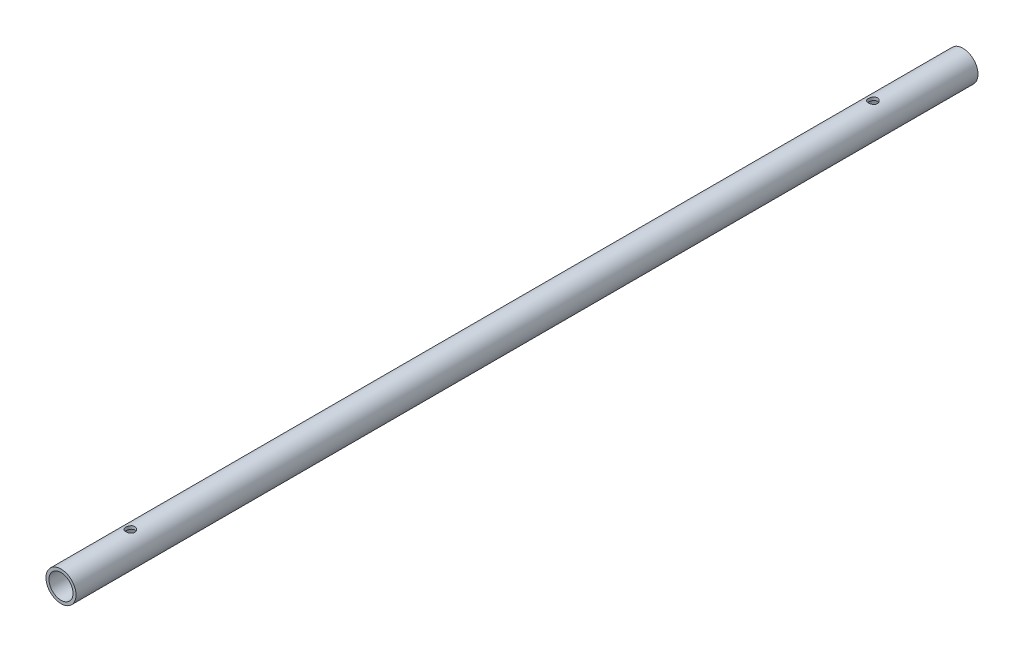
ISO-10303-21;
HEADER;
FILE_DESCRIPTION(('STEP AP214'),'2;1');
FILE_NAME('part.step','',(''),(''),'','','');
FILE_SCHEMA(('AUTOMOTIVE_DESIGN { 1 0 10303 214 1 1 1 1 }'));
ENDSEC;
DATA;
#1=APPLICATION_CONTEXT('core data for automotive mechanical design processes');
#2=APPLICATION_PROTOCOL_DEFINITION('international standard','automotive_design',2000,#1);
#3=PRODUCT_CONTEXT('',#1,'mechanical');
#4=PRODUCT('Part','Part','',(#3));
#5=PRODUCT_RELATED_PRODUCT_CATEGORY('part','',(#4));
#6=PRODUCT_DEFINITION_FORMATION('','',#4);
#7=PRODUCT_DEFINITION_CONTEXT('part definition',#1,'design');
#8=PRODUCT_DEFINITION('design','',#6,#7);
#9=PRODUCT_DEFINITION_SHAPE('','',#8);
#10=(LENGTH_UNIT() NAMED_UNIT(*) SI_UNIT(.MILLI.,.METRE.));
#11=(NAMED_UNIT(*) PLANE_ANGLE_UNIT() SI_UNIT($,.RADIAN.));
#12=(NAMED_UNIT(*) SI_UNIT($,.STERADIAN.) SOLID_ANGLE_UNIT());
#13=UNCERTAINTY_MEASURE_WITH_UNIT(LENGTH_MEASURE(1.E-05),#10,'distance_accuracy_value','');
#14=(GEOMETRIC_REPRESENTATION_CONTEXT(3) GLOBAL_UNCERTAINTY_ASSIGNED_CONTEXT((#13)) GLOBAL_UNIT_ASSIGNED_CONTEXT((#10,
#11,#12)) REPRESENTATION_CONTEXT('',''));
#15=CARTESIAN_POINT('',(0.,0.,0.));
#16=DIRECTION('',(0.,0.,1.));
#17=DIRECTION('',(1.,0.,0.));
#18=AXIS2_PLACEMENT_3D('',#15,#16,#17);
#19=CARTESIAN_POINT('',(0.,0.,300.));
#20=DIRECTION('',(0.,0.,-1.));
#21=DIRECTION('',(-1.,0.,0.));
#22=AXIS2_PLACEMENT_3D('',#19,#20,#21);
#23=CYLINDRICAL_SURFACE('',#22,5.);
#24=CARTESIAN_POINT('',(0.,0.,300.));
#25=DIRECTION('',(0.,0.,1.));
#26=DIRECTION('',(1.,0.,0.));
#27=AXIS2_PLACEMENT_3D('',#24,#25,#26);
#28=CIRCLE('',#27,5.);
#29=CARTESIAN_POINT('',(5.,0.,300.));
#30=VERTEX_POINT('',#29);
#31=EDGE_CURVE('E10',#30,#30,#28,.T.);
#32=ORIENTED_EDGE('',*,*,#31,.F.);
#33=EDGE_LOOP('',(#32));
#34=FACE_BOUND('',#33,.T.);
#35=CARTESIAN_POINT('',(0.,0.,0.));
#36=DIRECTION('',(0.,0.,1.));
#37=DIRECTION('',(1.,0.,0.));
#38=AXIS2_PLACEMENT_3D('',#35,#36,#37);
#39=CIRCLE('',#38,5.);
#40=CARTESIAN_POINT('',(5.,0.,0.));
#41=VERTEX_POINT('',#40);
#42=EDGE_CURVE('E52',#41,#41,#39,.T.);
#43=ORIENTED_EDGE('',*,*,#42,.T.);
#44=EDGE_LOOP('',(#43));
#45=FACE_BOUND('',#44,.T.);
#46=CARTESIAN_POINT('',(0.,5.,28.5));
#47=CARTESIAN_POINT('',(-0.0822886127532998,4.9999992925055,28.5000009974849));
#48=CARTESIAN_POINT('',(-0.164587318351529,4.99794915693954,28.506793863624));
#49=CARTESIAN_POINT('',(-0.32678812530488,4.98997105593691,28.5337213542221));
#50=CARTESIAN_POINT('',(-0.406689504411419,4.98404193389692,28.5538599580233));
#51=CARTESIAN_POINT('',(-0.561732707754526,4.96895552501836,28.6067460169103));
#52=CARTESIAN_POINT('',(-0.636881364395372,4.95980300250425,28.6394748696189));
#53=CARTESIAN_POINT('',(-0.78062418105313,4.93922109237645,28.7165360930558));
#54=CARTESIAN_POINT('',(-0.849217467469668,4.92779140192067,28.7608700073954));
#55=CARTESIAN_POINT('',(-0.979871797183743,4.90350737192774,28.8612240074727));
#56=CARTESIAN_POINT('',(-1.04171807124434,4.89062383657036,28.9175166258859));
#57=CARTESIAN_POINT('',(-1.15524920923324,4.86505834210442,29.0396092299102));
#58=CARTESIAN_POINT('',(-1.20693236327441,4.85237641724501,29.105410812125));
#59=CARTESIAN_POINT('',(-1.29980037723707,4.82834113993772,29.2464707530376));
#60=CARTESIAN_POINT('',(-1.34072309022213,4.81702406663875,29.3219084609907));
#61=CARTESIAN_POINT('',(-1.4092139477476,4.79743620394031,29.4789892542303));
#62=CARTESIAN_POINT('',(-1.43678529919973,4.78916468313311,29.560630843928));
#63=CARTESIAN_POINT('',(-1.47701633682652,4.77690870838434,29.7253902661305));
#64=CARTESIAN_POINT('',(-1.49007196234677,4.77281069324533,29.8084027438639));
#65=CARTESIAN_POINT('',(-1.50213730614672,4.76902789749767,29.9755331562168));
#66=CARTESIAN_POINT('',(-1.50115042761078,4.76934204760571,30.0596508180591));
#67=CARTESIAN_POINT('',(-1.48546977199812,4.77424744067778,30.2233839086085));
#68=CARTESIAN_POINT('',(-1.47127205262685,4.7786838859914,30.3030522503622));
#69=CARTESIAN_POINT('',(-1.43037420427056,4.79108356228624,30.4588197862735));
#70=CARTESIAN_POINT('',(-1.40367284141641,4.79904714132351,30.5349186273743));
#71=CARTESIAN_POINT('',(-1.33816026653682,4.81772733074973,30.6826003496607));
#72=CARTESIAN_POINT('',(-1.29918816934642,4.82848016115952,30.7541070839553));
#73=CARTESIAN_POINT('',(-1.21035222588683,4.85150987000065,30.8897320220102));
#74=CARTESIAN_POINT('',(-1.16048574002588,4.86378711746991,30.9538484294138));
#75=CARTESIAN_POINT('',(-1.04881290765546,4.88911011297937,31.075686190762));
#76=CARTESIAN_POINT('',(-0.986594907466973,4.90216654310498,31.1330286640297));
#77=CARTESIAN_POINT('',(-0.853263259313967,4.92712244063259,31.2365539840643));
#78=CARTESIAN_POINT('',(-0.782149051860888,4.9390218351841,31.2827361284144));
#79=CARTESIAN_POINT('',(-0.632355038342803,4.9604316006947,31.3628599224647));
#80=CARTESIAN_POINT('',(-0.553627749747951,4.96992543668314,31.3967175162499));
#81=CARTESIAN_POINT('',(-0.39124541560352,4.98533521832222,31.4505995900996));
#82=CARTESIAN_POINT('',(-0.307591751589582,4.99125216186999,31.4706279285325));
#83=CARTESIAN_POINT('',(-0.140952242668332,4.99868364643538,31.4956521778994));
#84=CARTESIAN_POINT('',(-0.0580500976011873,5.0003485041779,31.5011615858016));
#85=CARTESIAN_POINT('',(0.107499605823383,4.9995292324176,31.4984308442879));
#86=CARTESIAN_POINT('',(0.190147196690781,4.99704565677756,31.4901925303486));
#87=CARTESIAN_POINT('',(0.350903605309697,4.98830696987163,31.4606153888885));
#88=CARTESIAN_POINT('',(0.429072772614168,4.98213829799417,31.4395766124191));
#89=CARTESIAN_POINT('',(0.580754638954521,4.96674347841533,31.3853567672218));
#90=CARTESIAN_POINT('',(0.654266777025583,4.95751696321085,31.3521742389621));
#91=CARTESIAN_POINT('',(0.796437189461052,4.93669654351325,31.2737468345189));
#92=CARTESIAN_POINT('',(0.864943826199669,4.92505280829675,31.228240659052));
#93=CARTESIAN_POINT('',(0.993523307980145,4.90073468764318,31.1267752459472));
#94=CARTESIAN_POINT('',(1.05359403235593,4.8880600443108,31.0708133881123));
#95=CARTESIAN_POINT('',(1.16585744551027,4.86253171869138,30.9476126916307));
#96=CARTESIAN_POINT('',(1.21768481231504,4.84968825033268,30.8800381242283));
#97=CARTESIAN_POINT('',(1.30928995072154,4.82576515238463,30.7368720609865));
#98=CARTESIAN_POINT('',(1.34906803829472,4.81468547654651,30.6612807754418));
#99=CARTESIAN_POINT('',(1.41517347127168,4.79567189615055,30.5044675087453));
#100=CARTESIAN_POINT('',(1.4415634693705,4.78772337843827,30.4232738134634));
#101=CARTESIAN_POINT('',(1.48021730815114,4.77591594362794,30.2573120310685));
#102=CARTESIAN_POINT('',(1.49248598978779,4.772055625083,30.1725451792123));
#103=CARTESIAN_POINT('',(1.50221984485059,4.76899972496087,30.0056384816238));
#104=CARTESIAN_POINT('',(1.5002805530849,4.76961647442754,29.9235363489824));
#105=CARTESIAN_POINT('',(1.48307505444813,4.77499401288294,29.7608858966272));
#106=CARTESIAN_POINT('',(1.46780938124716,4.77975463592551,29.6803375148236));
#107=CARTESIAN_POINT('',(1.42476888804136,4.79275763670385,29.5240546008571));
#108=CARTESIAN_POINT('',(1.39715175507069,4.80095604545965,29.4482727126383));
#109=CARTESIAN_POINT('',(1.33031507121129,4.81990278909136,29.3023575611823));
#110=CARTESIAN_POINT('',(1.29109329962876,4.83065161194312,29.2322253823592));
#111=CARTESIAN_POINT('',(1.20048763805072,4.85397676425833,29.0968368834729));
#112=CARTESIAN_POINT('',(1.14871276092994,4.86660540163797,29.0318512387396));
#113=CARTESIAN_POINT('',(1.03517434629782,4.89201320450026,28.9112975016921));
#114=CARTESIAN_POINT('',(0.973408217134502,4.90479240823905,28.8557318605322));
#115=CARTESIAN_POINT('',(0.839465762183249,4.92950936570649,28.753976587705));
#116=CARTESIAN_POINT('',(0.767037885790609,4.94141159765674,28.7081085531445));
#117=CARTESIAN_POINT('',(0.615141373983531,4.96260680455813,28.629264830096));
#118=CARTESIAN_POINT('',(0.535676052998956,4.97190099931067,28.5962831117255));
#119=CARTESIAN_POINT('',(0.380757712655282,4.98602174969301,28.5471047243473));
#120=CARTESIAN_POINT('',(0.305786961954234,4.99122027381068,28.5294883271168));
#121=CARTESIAN_POINT('',(0.15388019523078,4.99820944494492,28.5059364747584));
#122=CARTESIAN_POINT('',(0.0769445098581397,5.0000006615474,28.4999990672952));
#123=CARTESIAN_POINT('',(0.,5.,28.5));
#124=B_SPLINE_CURVE_WITH_KNOTS('',3,(#46,#47,#48,#49,#50,#51,#52,#53,#54,#55,#56,#57,#58,#59,
#60,#61,#62,#63,#64,#65,#66,#67,#68,#69,#70,#71,#72,#73,#74,#75,#76,#77,#78,#79,#80,#81,#82,#83,
#84,#85,#86,#87,#88,#89,#90,#91,#92,#93,#94,#95,#96,#97,#98,#99,#100,#101,#102,#103,#104,#105,
#106,#107,#108,#109,#110,#111,#112,#113,#114,#115,#116,#117,#118,#119,#120,#121,#122,#123),
.UNSPECIFIED.,.T.,.F.,(4,2,2,2,2,2,2,2,2,2,2,2,2,2,2,2,2,2,2,2,2,2,2,2,2,2,2,2,2,2,2,2,2,2,2,2,
2,2,4),(0.,0.24658320361261,0.493239964845999,0.739533676300873,0.985860164412701,
1.23855602948191,1.49129437288633,1.74971481004109,2.00807314543224,2.25919689356599,
2.51025978319089,2.75226016697676,2.99428443658001,3.2396242644712,3.48502360158555,
3.74067104048167,3.99633456531072,4.25371046881689,4.51101453528808,4.75908809438545,
5.00712853550327,5.24956746682327,5.49203554593729,5.74011305702908,5.98825282000191,
6.24540400322819,6.50254844252681,6.75847814951252,7.01432009460283,7.25950155466943,
7.504673196616,7.74680040402721,7.98897397553107,8.23996925679931,8.49102974897502,
8.74942996156671,9.00770911595235,9.2383169193046,9.46888616948875),.UNSPECIFIED.);
#125=CARTESIAN_POINT('',(0.,5.,28.5));
#126=VERTEX_POINT('',#125);
#127=EDGE_CURVE('E68',#126,#126,#124,.T.);
#128=ORIENTED_EDGE('',*,*,#127,.F.);
#129=EDGE_LOOP('',(#128));
#130=FACE_BOUND('',#129,.T.);
#131=CARTESIAN_POINT('',(0.,5.,275.5));
#132=CARTESIAN_POINT('',(-0.0822886127533016,4.9999992925055,275.500000997485));
#133=CARTESIAN_POINT('',(-0.164587318351532,4.99794915693954,275.506793863624));
#134=CARTESIAN_POINT('',(-0.326788125304881,4.98997105593691,275.533721354222));
#135=CARTESIAN_POINT('',(-0.406689504411417,4.98404193389692,275.553859958023));
#136=CARTESIAN_POINT('',(-0.561732707754523,4.96895552501836,275.60674601691));
#137=CARTESIAN_POINT('',(-0.636881364395372,4.95980300250425,275.639474869619));
#138=CARTESIAN_POINT('',(-0.780624181053132,4.93922109237645,275.716536093056));
#139=CARTESIAN_POINT('',(-0.849217467469668,4.92779140192067,275.760870007395));
#140=CARTESIAN_POINT('',(-0.979871797183748,4.90350737192774,275.861224007473));
#141=CARTESIAN_POINT('',(-1.04171807124435,4.89062383657036,275.917516625886));
#142=CARTESIAN_POINT('',(-1.15524920923325,4.86505834210442,276.03960922991));
#143=CARTESIAN_POINT('',(-1.20693236327442,4.85237641724501,276.105410812125));
#144=CARTESIAN_POINT('',(-1.29980037723708,4.82834113993772,276.246470753037));
#145=CARTESIAN_POINT('',(-1.34072309022213,4.81702406663875,276.321908460991));
#146=CARTESIAN_POINT('',(-1.40921394774758,4.79743620394032,276.47898925423));
#147=CARTESIAN_POINT('',(-1.43678529919972,4.78916468313311,276.560630843928));
#148=CARTESIAN_POINT('',(-1.47701633682652,4.77690870838434,276.72539026613));
#149=CARTESIAN_POINT('',(-1.49007196234678,4.77281069324533,276.808402743864));
#150=CARTESIAN_POINT('',(-1.50213730614672,4.76902789749767,276.975533156217));
#151=CARTESIAN_POINT('',(-1.50115042761078,4.76934204760571,277.059650818059));
#152=CARTESIAN_POINT('',(-1.48546977199811,4.77424744067778,277.223383908608));
#153=CARTESIAN_POINT('',(-1.47127205262685,4.77868388599141,277.303052250362));
#154=CARTESIAN_POINT('',(-1.43037420427055,4.79108356228624,277.458819786273));
#155=CARTESIAN_POINT('',(-1.4036728414164,4.79904714132351,277.534918627374));
#156=CARTESIAN_POINT('',(-1.33816026653681,4.81772733074973,277.682600349661));
#157=CARTESIAN_POINT('',(-1.29918816934641,4.82848016115953,277.754107083955));
#158=CARTESIAN_POINT('',(-1.21035222588682,4.85150987000065,277.88973202201));
#159=CARTESIAN_POINT('',(-1.16048574002588,4.86378711746991,277.953848429414));
#160=CARTESIAN_POINT('',(-1.04881290765546,4.88911011297937,278.075686190762));
#161=CARTESIAN_POINT('',(-0.986594907466961,4.90216654310498,278.13302866403));
#162=CARTESIAN_POINT('',(-0.853263259313965,4.92712244063259,278.236553984064));
#163=CARTESIAN_POINT('',(-0.782149051860902,4.9390218351841,278.282736128414));
#164=CARTESIAN_POINT('',(-0.632355038342827,4.9604316006947,278.362859922465));
#165=CARTESIAN_POINT('',(-0.553627749747966,4.96992543668314,278.39671751625));
#166=CARTESIAN_POINT('',(-0.391245415603524,4.98533521832222,278.4505995901));
#167=CARTESIAN_POINT('',(-0.307591751589584,4.99125216186999,278.470627928532));
#168=CARTESIAN_POINT('',(-0.140952242668334,4.99868364643538,278.495652177899));
#169=CARTESIAN_POINT('',(-0.0580500976011923,5.0003485041779,278.501161585802));
#170=CARTESIAN_POINT('',(0.107499605823375,4.9995292324176,278.498430844288));
#171=CARTESIAN_POINT('',(0.190147196690773,4.99704565677756,278.490192530349));
#172=CARTESIAN_POINT('',(0.350903605309678,4.98830696987163,278.460615388888));
#173=CARTESIAN_POINT('',(0.42907277261414,4.98213829799417,278.439576612419));
#174=CARTESIAN_POINT('',(0.580754638954495,4.96674347841533,278.385356767222));
#175=CARTESIAN_POINT('',(0.654266777025569,4.95751696321085,278.352174238962));
#176=CARTESIAN_POINT('',(0.796437189461044,4.93669654351325,278.273746834519));
#177=CARTESIAN_POINT('',(0.864943826199653,4.92505280829675,278.228240659052));
#178=CARTESIAN_POINT('',(0.993523307980124,4.90073468764318,278.126775245947));
#179=CARTESIAN_POINT('',(1.05359403235591,4.8880600443108,278.070813388112));
#180=CARTESIAN_POINT('',(1.16585744551025,4.86253171869138,277.947612691631));
#181=CARTESIAN_POINT('',(1.21768481231502,4.84968825033268,277.880038124228));
#182=CARTESIAN_POINT('',(1.30928995072152,4.82576515238464,277.736872060986));
#183=CARTESIAN_POINT('',(1.34906803829472,4.81468547654651,277.661280775442));
#184=CARTESIAN_POINT('',(1.41517347127168,4.79567189615055,277.504467508745));
#185=CARTESIAN_POINT('',(1.44156346937049,4.78772337843827,277.423273813463));
#186=CARTESIAN_POINT('',(1.48021730815114,4.77591594362794,277.257312031068));
#187=CARTESIAN_POINT('',(1.49248598978779,4.772055625083,277.172545179212));
#188=CARTESIAN_POINT('',(1.50221984485059,4.76899972496087,277.005638481624));
#189=CARTESIAN_POINT('',(1.50028055308491,4.76961647442754,276.923536348982));
#190=CARTESIAN_POINT('',(1.48307505444814,4.77499401288294,276.760885896627));
#191=CARTESIAN_POINT('',(1.46780938124717,4.77975463592551,276.680337514824));
#192=CARTESIAN_POINT('',(1.42476888804137,4.79275763670385,276.524054600857));
#193=CARTESIAN_POINT('',(1.3971517550707,4.80095604545964,276.448272712638));
#194=CARTESIAN_POINT('',(1.33031507121131,4.81990278909136,276.302357561182));
#195=CARTESIAN_POINT('',(1.29109329962878,4.83065161194311,276.232225382359));
#196=CARTESIAN_POINT('',(1.20048763805073,4.85397676425833,276.096836883473));
#197=CARTESIAN_POINT('',(1.14871276092994,4.86660540163798,276.03185123874));
#198=CARTESIAN_POINT('',(1.0351743462978,4.89201320450026,275.911297501692));
#199=CARTESIAN_POINT('',(0.973408217134489,4.90479240823905,275.855731860532));
#200=CARTESIAN_POINT('',(0.839465762183245,4.92950936570649,275.753976587705));
#201=CARTESIAN_POINT('',(0.76703788579061,4.94141159765674,275.708108553144));
#202=CARTESIAN_POINT('',(0.615141373983533,4.96260680455813,275.629264830096));
#203=CARTESIAN_POINT('',(0.535676052998955,4.97190099931066,275.596283111725));
#204=CARTESIAN_POINT('',(0.380757712655281,4.98602174969301,275.547104724347));
#205=CARTESIAN_POINT('',(0.305786961954236,4.99122027381068,275.529488327117));
#206=CARTESIAN_POINT('',(0.153880195230782,4.99820944494492,275.505936474758));
#207=CARTESIAN_POINT('',(0.0769445098581406,5.0000006615474,275.499999067295));
#208=CARTESIAN_POINT('',(0.,5.,275.5));
#209=B_SPLINE_CURVE_WITH_KNOTS('',3,(#131,#132,#133,#134,#135,#136,#137,#138,#139,#140,#141,
#142,#143,#144,#145,#146,#147,#148,#149,#150,#151,#152,#153,#154,#155,#156,#157,#158,#159,#160,
#161,#162,#163,#164,#165,#166,#167,#168,#169,#170,#171,#172,#173,#174,#175,#176,#177,#178,#179,
#180,#181,#182,#183,#184,#185,#186,#187,#188,#189,#190,#191,#192,#193,#194,#195,#196,#197,#198,
#199,#200,#201,#202,#203,#204,#205,#206,#207,#208),.UNSPECIFIED.,.T.,.F.,(4,2,2,2,2,2,2,2,2,2,2,
2,2,2,2,2,2,2,2,2,2,2,2,2,2,2,2,2,2,2,2,2,2,2,2,2,2,2,4),(0.,0.246583203612611,
0.493239964845996,0.739533676300865,0.985860164412719,1.23855602948197,1.49129437288633,
1.74971481004108,2.0080731454322,2.25919689356603,2.51025978319092,2.75226016697681,
2.99428443658007,3.23962426447124,3.48502360158558,3.74067104048168,3.9963345653107,
4.25371046881688,4.51101453528809,4.75908809438545,5.00712853550326,5.24956746682325,
5.49203554593727,5.74011305702906,5.98825282000187,6.24540400322818,6.50254844252682,
6.7584781495125,7.01432009460279,7.25950155466941,7.50467319661597,7.74680040402722,
7.98897397553106,8.23996925679934,8.49102974897506,8.74942996156673,9.00770911595236,
9.23831691930462,9.46888616948876),.UNSPECIFIED.);
#210=CARTESIAN_POINT('',(0.,5.,275.5));
#211=VERTEX_POINT('',#210);
#212=EDGE_CURVE('E86',#211,#211,#209,.T.);
#213=ORIENTED_EDGE('',*,*,#212,.F.);
#214=EDGE_LOOP('',(#213));
#215=FACE_BOUND('',#214,.T.);
#216=ADVANCED_FACE('F39',(#34,#45,#130,#215),#23,.T.);
#217=CARTESIAN_POINT('',(0.,0.,300.));
#218=DIRECTION('',(0.,0.,-1.));
#219=DIRECTION('',(-1.,0.,0.));
#220=AXIS2_PLACEMENT_3D('',#217,#218,#219);
#221=CYLINDRICAL_SURFACE('',#220,4.);
#222=CARTESIAN_POINT('',(0.,4.,28.5));
#223=CARTESIAN_POINT('',(-0.0812350589378528,4.00000217456151,28.4999970976969));
#224=CARTESIAN_POINT('',(-0.162450241781792,3.99750379283184,28.5066197602484));
#225=CARTESIAN_POINT('',(-0.322453452352361,3.98778696006928,28.5328281952699));
#226=CARTESIAN_POINT('',(-0.401241827987616,3.98056918893993,28.5524121004706));
#227=CARTESIAN_POINT('',(-0.554060784990879,3.96218832391545,28.6037530017718));
#228=CARTESIAN_POINT('',(-0.628100224162277,3.9510328434944,28.6354865168218));
#229=CARTESIAN_POINT('',(-0.769799310160254,3.92588767765353,28.7101064130158));
#230=CARTESIAN_POINT('',(-0.83745723917788,3.91189723227548,28.7529957855442));
#231=CARTESIAN_POINT('',(-0.967346417045826,3.88186246971217,28.8506125310709));
#232=CARTESIAN_POINT('',(-1.02927073015119,3.86576002583566,28.9057302622594));
#233=CARTESIAN_POINT('',(-1.14324421474363,3.83360220871327,29.0254104346588));
#234=CARTESIAN_POINT('',(-1.19529036359203,3.81754685135033,29.0899757560879));
#235=CARTESIAN_POINT('',(-1.28998202215985,3.78662470617731,29.2297174675232));
#236=CARTESIAN_POINT('',(-1.3321939319576,3.77182648820818,29.3052043665458));
#237=CARTESIAN_POINT('',(-1.40318646334085,3.74599860237433,29.4628483541685));
#238=CARTESIAN_POINT('',(-1.43197244961239,3.73496742975881,29.5450027631551));
#239=CARTESIAN_POINT('',(-1.47408431017549,3.71854412824136,29.7101167402582));
#240=CARTESIAN_POINT('',(-1.48799593218558,3.71293924350838,29.7929050384354));
#241=CARTESIAN_POINT('',(-1.50179556531648,3.70738061461215,29.9598161579938));
#242=CARTESIAN_POINT('',(-1.50168936802631,3.70742453659305,30.0439384138745));
#243=CARTESIAN_POINT('',(-1.48790429610018,3.71297511632055,30.205769525213));
#244=CARTESIAN_POINT('',(-1.47503808509004,3.71815468871122,30.2835609060442));
#245=CARTESIAN_POINT('',(-1.4374416786833,3.73284938059529,30.4357871504053));
#246=CARTESIAN_POINT('',(-1.41270969663258,3.74236515298863,30.5102215066139));
#247=CARTESIAN_POINT('',(-1.35163748571904,3.76485702190253,30.6552770677282));
#248=CARTESIAN_POINT('',(-1.31508648737101,3.77789517988166,30.7257994861213));
#249=CARTESIAN_POINT('',(-1.23156073762698,3.80594210139319,30.859945737591));
#250=CARTESIAN_POINT('',(-1.18458238728897,3.82095154457158,30.9235671775197));
#251=CARTESIAN_POINT('',(-1.07781780766549,3.85248038859113,31.0466036636509));
#252=CARTESIAN_POINT('',(-1.01738298716955,3.86903347455671,31.1054486407481));
#253=CARTESIAN_POINT('',(-0.887312590819018,3.90091728164086,31.2123379662058));
#254=CARTESIAN_POINT('',(-0.81767560349736,3.91624781465952,31.2603806546057));
#255=CARTESIAN_POINT('',(-0.669723436992415,3.9442639480908,31.3449303970625));
#256=CARTESIAN_POINT('',(-0.591290713844716,3.95690498259616,31.3812475812211));
#257=CARTESIAN_POINT('',(-0.428836850524581,3.97778718326962,31.43998260427));
#258=CARTESIAN_POINT('',(-0.344818210845766,3.98603030341493,31.4624066165611));
#259=CARTESIAN_POINT('',(-0.178375243148664,3.99684443228065,31.4916227875419));
#260=CARTESIAN_POINT('',(-0.0961036195622085,3.99969369025686,31.4991826063825));
#261=CARTESIAN_POINT('',(0.0685724752550246,4.00025893700126,31.5006910638999));
#262=CARTESIAN_POINT('',(0.150976912983373,3.99797606386863,31.4946427203168));
#263=CARTESIAN_POINT('',(0.31026204856186,3.98871709772643,31.4696899576913));
#264=CARTESIAN_POINT('',(0.387233328007337,3.98192470962305,31.4512884562629));
#265=CARTESIAN_POINT('',(0.536941754957222,3.96451477091717,31.4028139274527));
#266=CARTESIAN_POINT('',(0.609678350347535,3.9538967228203,31.372739382052));
#267=CARTESIAN_POINT('',(0.751247765110155,3.92949624407681,31.3008135875605));
#268=CARTESIAN_POINT('',(0.819903083557796,3.91563000209348,31.2586422707766));
#269=CARTESIAN_POINT('',(0.949392711726626,3.88626671564664,31.1640818968284));
#270=CARTESIAN_POINT('',(1.01022412027045,3.87076907009516,31.1116890674548));
#271=CARTESIAN_POINT('',(1.12603079874454,3.83873329490989,30.9945958778757));
#272=CARTESIAN_POINT('',(1.18046154123569,3.82218696503729,30.9293578172273));
#273=CARTESIAN_POINT('',(1.27771050031903,3.79078815746854,30.7903486152923));
#274=CARTESIAN_POINT('',(1.32052767414519,3.77593583194399,30.7165767086115));
#275=CARTESIAN_POINT('',(1.39337773518998,3.74966829822463,30.5619840132277));
#276=CARTESIAN_POINT('',(1.42335685446918,3.73826760328493,30.4811352540896));
#277=CARTESIAN_POINT('',(1.46907883466889,3.72054032891005,30.3149902363122));
#278=CARTESIAN_POINT('',(1.48483050305535,3.71421061057491,30.2296967638019));
#279=CARTESIAN_POINT('',(1.50086347097839,3.70775894792573,30.0629838404589));
#280=CARTESIAN_POINT('',(1.50207331495837,3.70726444523341,29.9816673682831));
#281=CARTESIAN_POINT('',(1.49136715641593,3.71158412745292,29.8200546837238));
#282=CARTESIAN_POINT('',(1.47945239850124,3.71639780898899,29.7397583753284));
#283=CARTESIAN_POINT('',(1.44355815630242,3.73048141585432,29.5849527732834));
#284=CARTESIAN_POINT('',(1.41995798316524,3.73961085376663,29.5103416537547));
#285=CARTESIAN_POINT('',(1.3616969677992,3.76121548297845,29.3660944915056));
#286=CARTESIAN_POINT('',(1.32703332944945,3.77369151995215,29.2964597119299));
#287=CARTESIAN_POINT('',(1.24552075938154,3.80139723903965,29.1601732103024));
#288=CARTESIAN_POINT('',(1.1981283280301,3.81673698440964,29.0938692032001));
#289=CARTESIAN_POINT('',(1.09334485729906,3.84806246757177,28.9698584390288));
#290=CARTESIAN_POINT('',(1.03595064012808,3.86404840943145,28.9121544252132));
#291=CARTESIAN_POINT('',(0.909080396784623,3.89590424609881,28.8037980441782));
#292=CARTESIAN_POINT('',(0.839118644212992,3.91172104900645,28.7536962465653));
#293=CARTESIAN_POINT('',(0.691213223200821,3.9405451445703,28.6659773447234));
#294=CARTESIAN_POINT('',(0.613268934090622,3.95355221851559,28.6283612122636));
#295=CARTESIAN_POINT('',(0.447999082002312,3.9757429260668,28.5656231709517));
#296=CARTESIAN_POINT('',(0.360413422234208,3.98473657158356,28.5411129353981));
#297=CARTESIAN_POINT('',(0.181875733606382,3.99686242179587,28.5083070400793));
#298=CARTESIAN_POINT('',(0.0909254163648589,3.99999756603967,28.5000032485127));
#299=CARTESIAN_POINT('',(0.,4.,28.5));
#300=B_SPLINE_CURVE_WITH_KNOTS('',3,(#222,#223,#224,#225,#226,#227,#228,#229,#230,#231,#232,
#233,#234,#235,#236,#237,#238,#239,#240,#241,#242,#243,#244,#245,#246,#247,#248,#249,#250,#251,
#252,#253,#254,#255,#256,#257,#258,#259,#260,#261,#262,#263,#264,#265,#266,#267,#268,#269,#270,
#271,#272,#273,#274,#275,#276,#277,#278,#279,#280,#281,#282,#283,#284,#285,#286,#287,#288,#289,
#290,#291,#292,#293,#294,#295,#296,#297,#298,#299),.UNSPECIFIED.,.T.,.F.,(4,2,2,2,2,2,2,2,2,2,2,
2,2,2,2,2,2,2,2,2,2,2,2,2,2,2,2,2,2,2,2,2,2,2,2,2,2,2,4),(0.,0.24336980156056,0.48670454953046,
0.729571369213572,0.972503379609492,1.22473618582716,1.47704604925622,1.73896674501659,
2.00078269352134,2.25185874416902,2.50283106079707,2.73878345119971,2.97477138060589,
3.21522408387019,3.45575990744259,3.71246153335813,3.96920257905067,4.22991375286076,
4.49050899698846,4.73725019635926,4.98393668390521,5.2211443792384,5.45838293254454,
5.702592218596,5.94689180019868,6.20536519455658,6.46386178920141,6.72343066727204,
6.98283874956507,7.22558763480252,7.4683135021126,7.70363142426534,7.93900886656507,
8.18672471884272,8.43451941997062,8.69572329654039,8.95694749805102,9.22948515032042,
9.50188601796128),.UNSPECIFIED.);
#301=CARTESIAN_POINT('',(0.,4.,28.5));
#302=VERTEX_POINT('',#301);
#303=EDGE_CURVE('E62',#302,#302,#300,.T.);
#304=ORIENTED_EDGE('',*,*,#303,.T.);
#305=EDGE_LOOP('',(#304));
#306=FACE_BOUND('',#305,.T.);
#307=CARTESIAN_POINT('',(0.,0.,300.));
#308=DIRECTION('',(0.,0.,1.));
#309=DIRECTION('',(1.,0.,0.));
#310=AXIS2_PLACEMENT_3D('',#307,#308,#309);
#311=CIRCLE('',#310,4.);
#312=CARTESIAN_POINT('',(4.,0.,300.));
#313=VERTEX_POINT('',#312);
#314=EDGE_CURVE('E57',#313,#313,#311,.T.);
#315=ORIENTED_EDGE('',*,*,#314,.T.);
#316=EDGE_LOOP('',(#315));
#317=FACE_BOUND('',#316,.T.);
#318=CARTESIAN_POINT('',(0.,0.,0.));
#319=DIRECTION('',(0.,0.,1.));
#320=DIRECTION('',(1.,0.,0.));
#321=AXIS2_PLACEMENT_3D('',#318,#319,#320);
#322=CIRCLE('',#321,4.);
#323=CARTESIAN_POINT('',(4.,0.,0.));
#324=VERTEX_POINT('',#323);
#325=EDGE_CURVE('E60',#324,#324,#322,.T.);
#326=ORIENTED_EDGE('',*,*,#325,.F.);
#327=EDGE_LOOP('',(#326));
#328=FACE_BOUND('',#327,.T.);
#329=CARTESIAN_POINT('',(0.,4.,275.5));
#330=CARTESIAN_POINT('',(-0.0812350589378502,4.00000217456151,275.499997097697));
#331=CARTESIAN_POINT('',(-0.162450241781789,3.99750379283184,275.506619760248));
#332=CARTESIAN_POINT('',(-0.322453452352359,3.98778696006928,275.53282819527));
#333=CARTESIAN_POINT('',(-0.401241827987614,3.98056918893993,275.55241210047));
#334=CARTESIAN_POINT('',(-0.554060784990868,3.96218832391545,275.603753001772));
#335=CARTESIAN_POINT('',(-0.628100224162258,3.9510328434944,275.635486516822));
#336=CARTESIAN_POINT('',(-0.769799310160236,3.92588767765353,275.710106413016));
#337=CARTESIAN_POINT('',(-0.837457239177872,3.91189723227548,275.752995785544));
#338=CARTESIAN_POINT('',(-0.967346417045827,3.88186246971217,275.850612531071));
#339=CARTESIAN_POINT('',(-1.02927073015119,3.86576002583566,275.905730262259));
#340=CARTESIAN_POINT('',(-1.14324421474363,3.83360220871327,276.025410434659));
#341=CARTESIAN_POINT('',(-1.19529036359202,3.81754685135033,276.089975756088));
#342=CARTESIAN_POINT('',(-1.28998202215985,3.78662470617732,276.229717467523));
#343=CARTESIAN_POINT('',(-1.3321939319576,3.77182648820818,276.305204366546));
#344=CARTESIAN_POINT('',(-1.40318646334085,3.74599860237433,276.462848354168));
#345=CARTESIAN_POINT('',(-1.43197244961239,3.73496742975881,276.545002763155));
#346=CARTESIAN_POINT('',(-1.47408431017549,3.71854412824136,276.710116740258));
#347=CARTESIAN_POINT('',(-1.48799593218558,3.71293924350838,276.792905038435));
#348=CARTESIAN_POINT('',(-1.50179556531648,3.70738061461214,276.959816157994));
#349=CARTESIAN_POINT('',(-1.50168936802631,3.70742453659305,277.043938413874));
#350=CARTESIAN_POINT('',(-1.48790429610018,3.71297511632055,277.205769525213));
#351=CARTESIAN_POINT('',(-1.47503808509004,3.71815468871122,277.283560906044));
#352=CARTESIAN_POINT('',(-1.43744167868331,3.73284938059529,277.435787150405));
#353=CARTESIAN_POINT('',(-1.41270969663259,3.74236515298863,277.510221506614));
#354=CARTESIAN_POINT('',(-1.35163748571905,3.76485702190252,277.655277067728));
#355=CARTESIAN_POINT('',(-1.31508648737101,3.77789517988165,277.725799486121));
#356=CARTESIAN_POINT('',(-1.23156073762698,3.80594210139319,277.859945737591));
#357=CARTESIAN_POINT('',(-1.18458238728898,3.82095154457157,277.92356717752));
#358=CARTESIAN_POINT('',(-1.0778178076655,3.85248038859113,278.046603663651));
#359=CARTESIAN_POINT('',(-1.01738298716956,3.8690334745567,278.105448640748));
#360=CARTESIAN_POINT('',(-0.887312590819024,3.90091728164085,278.212337966206));
#361=CARTESIAN_POINT('',(-0.817675603497363,3.91624781465952,278.260380654606));
#362=CARTESIAN_POINT('',(-0.669723436992418,3.9442639480908,278.344930397062));
#363=CARTESIAN_POINT('',(-0.591290713844721,3.95690498259616,278.381247581221));
#364=CARTESIAN_POINT('',(-0.42883685052459,3.97778718326962,278.43998260427));
#365=CARTESIAN_POINT('',(-0.344818210845777,3.98603030341493,278.462406616561));
#366=CARTESIAN_POINT('',(-0.178375243148679,3.99684443228065,278.491622787542));
#367=CARTESIAN_POINT('',(-0.0961036195622244,3.99969369025686,278.499182606382));
#368=CARTESIAN_POINT('',(0.0685724752550096,4.00025893700126,278.5006910639));
#369=CARTESIAN_POINT('',(0.15097691298336,3.99797606386863,278.494642720317));
#370=CARTESIAN_POINT('',(0.310262048561846,3.98871709772643,278.469689957691));
#371=CARTESIAN_POINT('',(0.387233328007323,3.98192470962305,278.451288456263));
#372=CARTESIAN_POINT('',(0.536941754957214,3.96451477091717,278.402813927453));
#373=CARTESIAN_POINT('',(0.609678350347535,3.9538967228203,278.372739382052));
#374=CARTESIAN_POINT('',(0.751247765110158,3.92949624407681,278.30081358756));
#375=CARTESIAN_POINT('',(0.819903083557792,3.91563000209348,278.258642270777));
#376=CARTESIAN_POINT('',(0.949392711726619,3.88626671564664,278.164081896828));
#377=CARTESIAN_POINT('',(1.01022412027045,3.87076907009516,278.111689067455));
#378=CARTESIAN_POINT('',(1.12603079874455,3.83873329490989,277.994595877876));
#379=CARTESIAN_POINT('',(1.18046154123569,3.82218696503729,277.929357817227));
#380=CARTESIAN_POINT('',(1.27771050031904,3.79078815746853,277.790348615292));
#381=CARTESIAN_POINT('',(1.32052767414519,3.77593583194399,277.716576708611));
#382=CARTESIAN_POINT('',(1.39337773518997,3.74966829822464,277.561984013228));
#383=CARTESIAN_POINT('',(1.42335685446917,3.73826760328494,277.48113525409));
#384=CARTESIAN_POINT('',(1.46907883466888,3.72054032891005,277.314990236312));
#385=CARTESIAN_POINT('',(1.48483050305535,3.71421061057491,277.229696763802));
#386=CARTESIAN_POINT('',(1.50086347097839,3.70775894792573,277.062983840459));
#387=CARTESIAN_POINT('',(1.50207331495837,3.70726444523341,276.981667368283));
#388=CARTESIAN_POINT('',(1.49136715641593,3.71158412745292,276.820054683724));
#389=CARTESIAN_POINT('',(1.47945239850124,3.71639780898899,276.739758375328));
#390=CARTESIAN_POINT('',(1.44355815630243,3.73048141585432,276.584952773283));
#391=CARTESIAN_POINT('',(1.41995798316526,3.73961085376662,276.510341653755));
#392=CARTESIAN_POINT('',(1.36169696779922,3.76121548297844,276.366094491506));
#393=CARTESIAN_POINT('',(1.32703332944947,3.77369151995214,276.29645971193));
#394=CARTESIAN_POINT('',(1.24552075938156,3.80139723903964,276.160173210302));
#395=CARTESIAN_POINT('',(1.19812832803012,3.81673698440964,276.0938692032));
#396=CARTESIAN_POINT('',(1.09334485729906,3.84806246757177,275.969858439029));
#397=CARTESIAN_POINT('',(1.03595064012808,3.86404840943145,275.912154425213));
#398=CARTESIAN_POINT('',(0.909080396784623,3.89590424609881,275.803798044178));
#399=CARTESIAN_POINT('',(0.839118644212998,3.91172104900644,275.753696246565));
#400=CARTESIAN_POINT('',(0.691213223200837,3.9405451445703,275.665977344723));
#401=CARTESIAN_POINT('',(0.61326893409064,3.95355221851559,275.628361212264));
#402=CARTESIAN_POINT('',(0.447999082002327,3.9757429260668,275.565623170952));
#403=CARTESIAN_POINT('',(0.360413422234218,3.98473657158356,275.541112935398));
#404=CARTESIAN_POINT('',(0.181875733606386,3.99686242179587,275.508307040079));
#405=CARTESIAN_POINT('',(0.0909254163648626,3.99999756603967,275.500003248513));
#406=CARTESIAN_POINT('',(0.,4.,275.5));
#407=B_SPLINE_CURVE_WITH_KNOTS('',3,(#329,#330,#331,#332,#333,#334,#335,#336,#337,#338,#339,
#340,#341,#342,#343,#344,#345,#346,#347,#348,#349,#350,#351,#352,#353,#354,#355,#356,#357,#358,
#359,#360,#361,#362,#363,#364,#365,#366,#367,#368,#369,#370,#371,#372,#373,#374,#375,#376,#377,
#378,#379,#380,#381,#382,#383,#384,#385,#386,#387,#388,#389,#390,#391,#392,#393,#394,#395,#396,
#397,#398,#399,#400,#401,#402,#403,#404,#405,#406),.UNSPECIFIED.,.T.,.F.,(4,2,2,2,2,2,2,2,2,2,2,
2,2,2,2,2,2,2,2,2,2,2,2,2,2,2,2,2,2,2,2,2,2,2,2,2,2,2,4),(0.,0.243369801560553,
0.486704549530461,0.729571369213556,0.972503379609491,1.22473618582714,1.47704604925623,
1.73896674501659,2.00078269352135,2.25185874416902,2.50283106079711,2.7387834511997,
2.97477138060587,3.21522408387019,3.45575990744259,3.71246153335813,3.96920257905065,
4.22991375286074,4.49050899698844,4.73725019635924,4.9839366839052,5.22114437923839,
5.45838293254452,5.702592218596,5.94689180019869,6.20536519455659,6.46386178920142,
6.72343066727195,6.98283874956507,7.22558763480247,7.46831350211249,7.70363142426527,
7.93900886656502,8.18672471884269,8.43451941997063,8.69572329654036,8.95694749805101,
9.2294851503204,9.50188601796127),.UNSPECIFIED.);
#408=CARTESIAN_POINT('',(0.,4.,275.5));
#409=VERTEX_POINT('',#408);
#410=EDGE_CURVE('E43',#409,#409,#407,.T.);
#411=ORIENTED_EDGE('',*,*,#410,.T.);
#412=EDGE_LOOP('',(#411));
#413=FACE_BOUND('',#412,.T.);
#414=ADVANCED_FACE('F69',(#306,#317,#328,#413),#221,.F.);
#415=CARTESIAN_POINT('',(0.,0.,300.));
#416=DIRECTION('',(0.,0.,1.));
#417=DIRECTION('',(1.,0.,0.));
#418=AXIS2_PLACEMENT_3D('',#415,#416,#417);
#419=PLANE('',#418);
#420=ORIENTED_EDGE('',*,*,#31,.T.);
#421=EDGE_LOOP('',(#420));
#422=FACE_BOUND('',#421,.T.);
#423=ORIENTED_EDGE('',*,*,#314,.F.);
#424=EDGE_LOOP('',(#423));
#425=FACE_BOUND('',#424,.T.);
#426=ADVANCED_FACE('F100',(#422,#425),#419,.T.);
#427=CARTESIAN_POINT('',(0.,0.,0.));
#428=DIRECTION('',(0.,0.,1.));
#429=DIRECTION('',(1.,0.,0.));
#430=AXIS2_PLACEMENT_3D('',#427,#428,#429);
#431=PLANE('',#430);
#432=ORIENTED_EDGE('',*,*,#42,.F.);
#433=EDGE_LOOP('',(#432));
#434=FACE_BOUND('',#433,.T.);
#435=ORIENTED_EDGE('',*,*,#325,.T.);
#436=EDGE_LOOP('',(#435));
#437=FACE_BOUND('',#436,.T.);
#438=ADVANCED_FACE('F76',(#434,#437),#431,.F.);
#439=CARTESIAN_POINT('',(0.,5.,30.));
#440=DIRECTION('',(0.,-1.,0.));
#441=DIRECTION('',(0.,0.,-1.));
#442=AXIS2_PLACEMENT_3D('',#439,#440,#441);
#443=CYLINDRICAL_SURFACE('',#442,1.5);
#444=ORIENTED_EDGE('',*,*,#303,.F.);
#445=EDGE_LOOP('',(#444));
#446=FACE_BOUND('',#445,.T.);
#447=ORIENTED_EDGE('',*,*,#127,.T.);
#448=EDGE_LOOP('',(#447));
#449=FACE_BOUND('',#448,.T.);
#450=ADVANCED_FACE('F72',(#446,#449),#443,.F.);
#451=CARTESIAN_POINT('',(0.,5.,277.));
#452=DIRECTION('',(0.,-1.,0.));
#453=DIRECTION('',(0.,0.,-1.));
#454=AXIS2_PLACEMENT_3D('',#451,#452,#453);
#455=CYLINDRICAL_SURFACE('',#454,1.5);
#456=ORIENTED_EDGE('',*,*,#410,.F.);
#457=EDGE_LOOP('',(#456));
#458=FACE_BOUND('',#457,.T.);
#459=ORIENTED_EDGE('',*,*,#212,.T.);
#460=EDGE_LOOP('',(#459));
#461=FACE_BOUND('',#460,.T.);
#462=ADVANCED_FACE('F75',(#458,#461),#455,.F.);
#463=CLOSED_SHELL('',(#216,#414,#426,#438,#450,#462));
#464=MANIFOLD_SOLID_BREP('B2',#463);
#465=ADVANCED_BREP_SHAPE_REPRESENTATION('',(#18,#464),#14);
#466=SHAPE_DEFINITION_REPRESENTATION(#9,#465);
ENDSEC;
END-ISO-10303-21;
